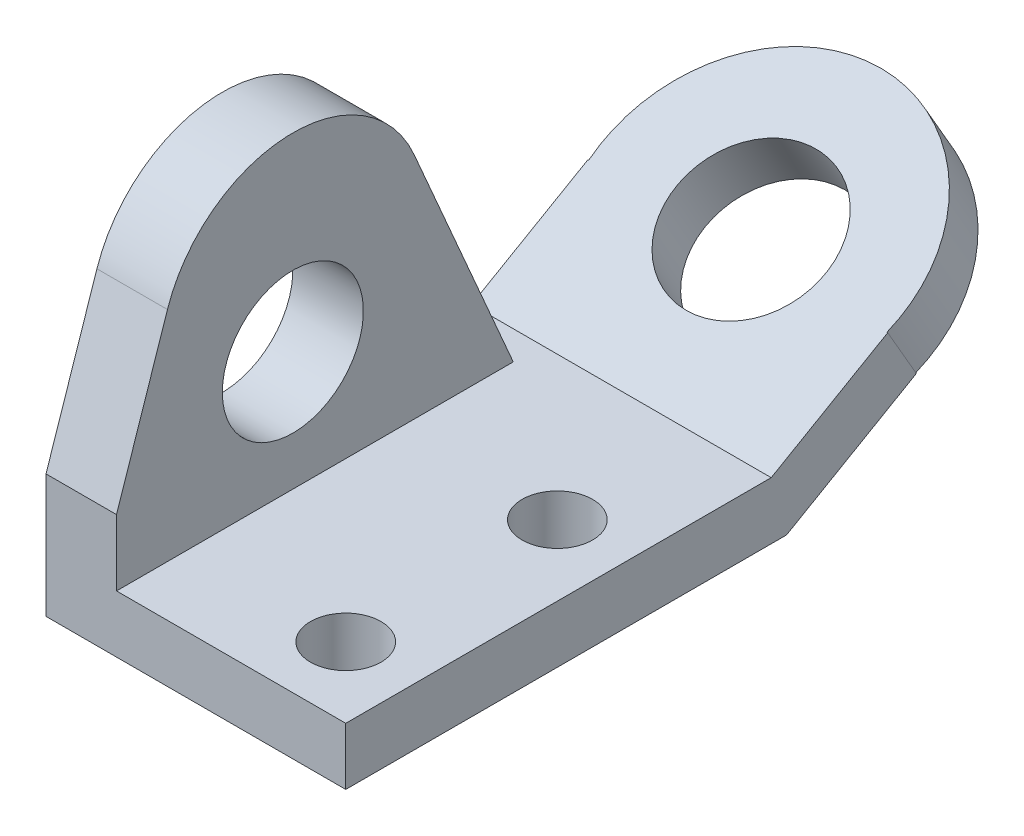
ISO-10303-21;
HEADER;
FILE_DESCRIPTION(('STEP AP214'),'2;1');
FILE_NAME('part.step','',(''),(''),'','','');
FILE_SCHEMA(('AUTOMOTIVE_DESIGN { 1 0 10303 214 1 1 1 1 }'));
ENDSEC;
DATA;
#1=APPLICATION_CONTEXT('core data for automotive mechanical design processes');
#2=APPLICATION_PROTOCOL_DEFINITION('international standard','automotive_design',2000,#1);
#3=PRODUCT_CONTEXT('',#1,'mechanical');
#4=PRODUCT('Part','Part','',(#3));
#5=PRODUCT_RELATED_PRODUCT_CATEGORY('part','',(#4));
#6=PRODUCT_DEFINITION_FORMATION('','',#4);
#7=PRODUCT_DEFINITION_CONTEXT('part definition',#1,'design');
#8=PRODUCT_DEFINITION('design','',#6,#7);
#9=PRODUCT_DEFINITION_SHAPE('','',#8);
#10=(LENGTH_UNIT() NAMED_UNIT(*) SI_UNIT(.MILLI.,.METRE.));
#11=(NAMED_UNIT(*) PLANE_ANGLE_UNIT() SI_UNIT($,.RADIAN.));
#12=(NAMED_UNIT(*) SI_UNIT($,.STERADIAN.) SOLID_ANGLE_UNIT());
#13=UNCERTAINTY_MEASURE_WITH_UNIT(LENGTH_MEASURE(1.E-05),#10,'distance_accuracy_value','');
#14=(GEOMETRIC_REPRESENTATION_CONTEXT(3) GLOBAL_UNCERTAINTY_ASSIGNED_CONTEXT((#13)) GLOBAL_UNIT_ASSIGNED_CONTEXT((#10,
#11,#12)) REPRESENTATION_CONTEXT('',''));
#15=CARTESIAN_POINT('',(0.,0.,0.));
#16=DIRECTION('',(0.,0.,1.));
#17=DIRECTION('',(1.,0.,0.));
#18=AXIS2_PLACEMENT_3D('',#15,#16,#17);
#19=CARTESIAN_POINT('',(-34.,0.,0.));
#20=DIRECTION('',(0.,1.,0.));
#21=DIRECTION('',(0.,0.,1.));
#22=AXIS2_PLACEMENT_3D('',#19,#20,#21);
#23=PLANE('',#22);
#24=DIRECTION('',(-1.,0.,0.));
#25=VECTOR('',#24,1.);
#26=CARTESIAN_POINT('',(-26.,0.,-25.));
#27=LINE('',#26,#25);
#28=CARTESIAN_POINT('',(-26.,0.,-25.));
#29=VERTEX_POINT('',#28);
#30=CARTESIAN_POINT('',(-34.,0.,-25.));
#31=VERTEX_POINT('',#30);
#32=EDGE_CURVE('E222',#29,#31,#27,.T.);
#33=ORIENTED_EDGE('',*,*,#32,.F.);
#34=DIRECTION('',(0.,0.,1.));
#35=VECTOR('',#34,1.);
#36=CARTESIAN_POINT('',(-26.,0.,-25.));
#37=LINE('',#36,#35);
#38=CARTESIAN_POINT('',(-26.,0.,20.));
#39=VERTEX_POINT('',#38);
#40=EDGE_CURVE('E199',#29,#39,#37,.T.);
#41=ORIENTED_EDGE('',*,*,#40,.T.);
#42=DIRECTION('',(1.,0.,0.));
#43=VECTOR('',#42,1.);
#44=CARTESIAN_POINT('',(-34.,0.,20.));
#45=LINE('',#44,#43);
#46=CARTESIAN_POINT('',(0.,0.,20.));
#47=VERTEX_POINT('',#46);
#48=EDGE_CURVE('E158',#39,#47,#45,.T.);
#49=ORIENTED_EDGE('',*,*,#48,.T.);
#50=DIRECTION('',(0.,0.,1.));
#51=VECTOR('',#50,1.);
#52=CARTESIAN_POINT('',(0.,0.,0.));
#53=LINE('',#52,#51);
#54=CARTESIAN_POINT('',(0.,0.,-28.2583302491977));
#55=VERTEX_POINT('',#54);
#56=EDGE_CURVE('E146',#55,#47,#53,.T.);
#57=ORIENTED_EDGE('',*,*,#56,.F.);
#58=DIRECTION('',(1.,0.,0.));
#59=VECTOR('',#58,1.);
#60=CARTESIAN_POINT('',(-34.,0.,-28.2583302491977));
#61=LINE('',#60,#59);
#62=CARTESIAN_POINT('',(-34.,0.,-28.2583302491977));
#63=VERTEX_POINT('',#62);
#64=EDGE_CURVE('E47',#63,#55,#61,.T.);
#65=ORIENTED_EDGE('',*,*,#64,.F.);
#66=DIRECTION('',(0.,0.,1.));
#67=VECTOR('',#66,1.);
#68=CARTESIAN_POINT('',(-34.,0.,20.));
#69=LINE('',#68,#67);
#70=EDGE_CURVE('E148',#63,#31,#69,.T.);
#71=ORIENTED_EDGE('',*,*,#70,.T.);
#72=EDGE_LOOP('',(#33,#41,#49,#57,#65,#71));
#73=FACE_BOUND('',#72,.T.);
#74=CARTESIAN_POINT('',(-8.,0.,12.));
#75=DIRECTION('',(0.,1.,0.));
#76=DIRECTION('',(0.,0.,1.));
#77=AXIS2_PLACEMENT_3D('',#74,#75,#76);
#78=CIRCLE('',#77,4.);
#79=CARTESIAN_POINT('',(-8.,0.,16.));
#80=VERTEX_POINT('',#79);
#81=EDGE_CURVE('E174',#80,#80,#78,.T.);
#82=ORIENTED_EDGE('',*,*,#81,.F.);
#83=EDGE_LOOP('',(#82));
#84=FACE_BOUND('',#83,.T.);
#85=CARTESIAN_POINT('',(-8.,0.,-12.));
#86=DIRECTION('',(0.,1.,0.));
#87=DIRECTION('',(0.,0.,1.));
#88=AXIS2_PLACEMENT_3D('',#85,#86,#87);
#89=CIRCLE('',#88,4.);
#90=CARTESIAN_POINT('',(-8.,0.,-8.));
#91=VERTEX_POINT('',#90);
#92=EDGE_CURVE('E225',#91,#91,#89,.T.);
#93=ORIENTED_EDGE('',*,*,#92,.F.);
#94=EDGE_LOOP('',(#93));
#95=FACE_BOUND('',#94,.T.);
#96=ADVANCED_FACE('F39',(#73,#84,#95),#23,.T.);
#97=CARTESIAN_POINT('',(-34.,0.,-28.2583302491977));
#98=DIRECTION('',(0.,0.866025403784438,0.500000000000002));
#99=DIRECTION('',(0.,-0.500000000000002,0.866025403784438));
#100=AXIS2_PLACEMENT_3D('',#97,#98,#99);
#101=PLANE('',#100);
#102=CARTESIAN_POINT('',(-17.,8.50000000000004,-42.9807621135332));
#103=DIRECTION('',(0.,0.866025403784438,0.500000000000002));
#104=DIRECTION('',(0.,-0.500000000000002,0.866025403784438));
#105=AXIS2_PLACEMENT_3D('',#102,#103,#104);
#106=CIRCLE('',#105,8.5);
#107=CARTESIAN_POINT('',(-17.,4.25000000000003,-35.6195461813655));
#108=VERTEX_POINT('',#107);
#109=EDGE_CURVE('E257',#108,#108,#106,.T.);
#110=ORIENTED_EDGE('',*,*,#109,.F.);
#111=EDGE_LOOP('',(#110));
#112=FACE_BOUND('',#111,.T.);
#113=ORIENTED_EDGE('',*,*,#64,.T.);
#114=DIRECTION('',(0.,-0.500000000000002,0.866025403784438));
#115=VECTOR('',#114,1.);
#116=CARTESIAN_POINT('',(0.,0.,-28.2583302491977));
#117=LINE('',#116,#115);
#118=CARTESIAN_POINT('',(0.,7.62916512459887,-41.4724318643354));
#119=VERTEX_POINT('',#118);
#120=EDGE_CURVE('E137',#119,#55,#117,.T.);
#121=ORIENTED_EDGE('',*,*,#120,.F.);
#122=DIRECTION('',(1.,0.,0.));
#123=VECTOR('',#122,1.);
#124=CARTESIAN_POINT('',(-34.001,7.62916512459887,-41.4724318643354));
#125=LINE('',#124,#123);
#126=CARTESIAN_POINT('',(-0.0894533950217824,7.62916512459887,-41.4724318643354));
#127=VERTEX_POINT('',#126);
#128=EDGE_CURVE('E122',#127,#119,#125,.T.);
#129=ORIENTED_EDGE('',*,*,#128,.F.);
#130=CARTESIAN_POINT('',(-17.,8.50000000000004,-42.9807621135332));
#131=DIRECTION('',(0.,0.866025403784438,0.500000000000002));
#132=DIRECTION('',(0.,-0.500000000000002,0.866025403784438));
#133=AXIS2_PLACEMENT_3D('',#130,#131,#132);
#134=CIRCLE('',#133,17.);
#135=CARTESIAN_POINT('',(-33.9105466049782,7.62916512459887,-41.4724318643354));
#136=VERTEX_POINT('',#135);
#137=EDGE_CURVE('E254',#127,#136,#134,.T.);
#138=ORIENTED_EDGE('',*,*,#137,.T.);
#139=CARTESIAN_POINT('',(-34.,7.62916512459887,-41.4724318643354));
#140=VERTEX_POINT('',#139);
#141=EDGE_CURVE('E131',#140,#136,#125,.T.);
#142=ORIENTED_EDGE('',*,*,#141,.F.);
#143=DIRECTION('',(0.,-0.500000000000002,0.866025403784438));
#144=VECTOR('',#143,1.);
#145=CARTESIAN_POINT('',(-34.,0.,-28.2583302491977));
#146=LINE('',#145,#144);
#147=EDGE_CURVE('E159',#140,#63,#146,.T.);
#148=ORIENTED_EDGE('',*,*,#147,.T.);
#149=EDGE_LOOP('',(#113,#121,#129,#138,#142,#148));
#150=FACE_BOUND('',#149,.T.);
#151=ADVANCED_FACE('F144',(#112,#150),#101,.T.);
#152=CARTESIAN_POINT('',(-34.,10.5,-59.4448637286709));
#153=DIRECTION('',(0.,-0.866025403784438,-0.500000000000001));
#154=DIRECTION('',(0.,0.500000000000001,-0.866025403784438));
#155=AXIS2_PLACEMENT_3D('',#152,#153,#154);
#156=PLANE('',#155);
#157=CARTESIAN_POINT('',(-17.,2.8708348754012,-46.2307621135332));
#158=DIRECTION('',(0.,-0.866025403784438,-0.500000000000001));
#159=DIRECTION('',(0.,0.500000000000001,-0.866025403784438));
#160=AXIS2_PLACEMENT_3D('',#157,#158,#159);
#161=CIRCLE('',#160,8.5);
#162=CARTESIAN_POINT('',(-17.,7.12083487540121,-53.5919780457009));
#163=VERTEX_POINT('',#162);
#164=EDGE_CURVE('E260',#163,#163,#161,.F.);
#165=ORIENTED_EDGE('',*,*,#164,.T.);
#166=EDGE_LOOP('',(#165));
#167=FACE_BOUND('',#166,.T.);
#168=DIRECTION('',(1.,0.,0.));
#169=VECTOR('',#168,1.);
#170=CARTESIAN_POINT('',(-34.001,2.00000000000003,-44.7224318643354));
#171=LINE('',#170,#169);
#172=CARTESIAN_POINT('',(-34.,2.00000000000003,-44.7224318643354));
#173=VERTEX_POINT('',#172);
#174=CARTESIAN_POINT('',(-33.9105466049782,2.00000000000003,-44.7224318643354));
#175=VERTEX_POINT('',#174);
#176=EDGE_CURVE('E188',#173,#175,#171,.T.);
#177=ORIENTED_EDGE('',*,*,#176,.T.);
#178=CARTESIAN_POINT('',(-17.,2.87083487540119,-46.2307621135332));
#179=DIRECTION('',(0.,0.866025403784438,0.500000000000002));
#180=DIRECTION('',(0.,-0.500000000000002,0.866025403784438));
#181=AXIS2_PLACEMENT_3D('',#178,#179,#180);
#182=CIRCLE('',#181,17.);
#183=CARTESIAN_POINT('',(-0.0894533950217824,2.00000000000003,-44.7224318643354));
#184=VERTEX_POINT('',#183);
#185=EDGE_CURVE('E187',#184,#175,#182,.T.);
#186=ORIENTED_EDGE('',*,*,#185,.F.);
#187=CARTESIAN_POINT('',(0.,2.00000000000003,-44.7224318643354));
#188=VERTEX_POINT('',#187);
#189=EDGE_CURVE('E54',#184,#188,#171,.T.);
#190=ORIENTED_EDGE('',*,*,#189,.T.);
#191=DIRECTION('',(0.,0.500000000000001,-0.866025403784438));
#192=VECTOR('',#191,1.);
#193=CARTESIAN_POINT('',(0.,10.5,-59.4448637286709));
#194=LINE('',#193,#192);
#195=CARTESIAN_POINT('',(0.,-6.49999999999999,-30.));
#196=VERTEX_POINT('',#195);
#197=EDGE_CURVE('E141',#196,#188,#194,.T.);
#198=ORIENTED_EDGE('',*,*,#197,.F.);
#199=DIRECTION('',(1.,0.,0.));
#200=VECTOR('',#199,1.);
#201=CARTESIAN_POINT('',(-34.,-6.49999999999999,-30.));
#202=LINE('',#201,#200);
#203=CARTESIAN_POINT('',(-34.,-6.49999999999999,-30.));
#204=VERTEX_POINT('',#203);
#205=EDGE_CURVE('E155',#204,#196,#202,.T.);
#206=ORIENTED_EDGE('',*,*,#205,.F.);
#207=DIRECTION('',(0.,0.500000000000001,-0.866025403784438));
#208=VECTOR('',#207,1.);
#209=CARTESIAN_POINT('',(-34.,10.5,-59.4448637286709));
#210=LINE('',#209,#208);
#211=EDGE_CURVE('E162',#204,#173,#210,.T.);
#212=ORIENTED_EDGE('',*,*,#211,.T.);
#213=EDGE_LOOP('',(#177,#186,#190,#198,#206,#212));
#214=FACE_BOUND('',#213,.T.);
#215=ADVANCED_FACE('F184',(#167,#214),#156,.T.);
#216=CARTESIAN_POINT('',(-34.,-6.49999999999999,-30.));
#217=DIRECTION('',(0.,-1.,0.));
#218=DIRECTION('',(0.,0.,-1.));
#219=AXIS2_PLACEMENT_3D('',#216,#217,#218);
#220=PLANE('',#219);
#221=CARTESIAN_POINT('',(-8.,-6.5,12.));
#222=DIRECTION('',(0.,-1.,0.));
#223=DIRECTION('',(0.,0.,-1.));
#224=AXIS2_PLACEMENT_3D('',#221,#222,#223);
#225=CIRCLE('',#224,4.);
#226=CARTESIAN_POINT('',(-8.,-6.5,16.));
#227=VERTEX_POINT('',#226);
#228=EDGE_CURVE('E234',#227,#227,#225,.F.);
#229=ORIENTED_EDGE('',*,*,#228,.T.);
#230=EDGE_LOOP('',(#229));
#231=FACE_BOUND('',#230,.T.);
#232=CARTESIAN_POINT('',(-8.,-6.5,-12.));
#233=DIRECTION('',(0.,-1.,0.));
#234=DIRECTION('',(0.,0.,-1.));
#235=AXIS2_PLACEMENT_3D('',#232,#233,#234);
#236=CIRCLE('',#235,4.);
#237=CARTESIAN_POINT('',(-8.,-6.5,-8.));
#238=VERTEX_POINT('',#237);
#239=EDGE_CURVE('E237',#238,#238,#236,.F.);
#240=ORIENTED_EDGE('',*,*,#239,.T.);
#241=EDGE_LOOP('',(#240));
#242=FACE_BOUND('',#241,.T.);
#243=DIRECTION('',(0.,0.,-1.));
#244=VECTOR('',#243,1.);
#245=CARTESIAN_POINT('',(0.,-6.49999999999999,-30.));
#246=LINE('',#245,#244);
#247=CARTESIAN_POINT('',(0.,-6.5,20.));
#248=VERTEX_POINT('',#247);
#249=EDGE_CURVE('E150',#248,#196,#246,.T.);
#250=ORIENTED_EDGE('',*,*,#249,.F.);
#251=DIRECTION('',(1.,0.,0.));
#252=VECTOR('',#251,1.);
#253=CARTESIAN_POINT('',(-34.,-6.5,20.));
#254=LINE('',#253,#252);
#255=CARTESIAN_POINT('',(-34.,-6.5,20.));
#256=VERTEX_POINT('',#255);
#257=EDGE_CURVE('E157',#256,#248,#254,.T.);
#258=ORIENTED_EDGE('',*,*,#257,.F.);
#259=DIRECTION('',(0.,0.,-1.));
#260=VECTOR('',#259,1.);
#261=CARTESIAN_POINT('',(-34.,-6.49999999999999,-30.));
#262=LINE('',#261,#260);
#263=EDGE_CURVE('E168',#256,#204,#262,.T.);
#264=ORIENTED_EDGE('',*,*,#263,.T.);
#265=ORIENTED_EDGE('',*,*,#205,.T.);
#266=EDGE_LOOP('',(#250,#258,#264,#265));
#267=FACE_BOUND('',#266,.T.);
#268=ADVANCED_FACE('F178',(#231,#242,#267),#220,.T.);
#269=CARTESIAN_POINT('',(-34.,-6.5,20.));
#270=DIRECTION('',(0.,0.,1.));
#271=DIRECTION('',(1.,0.,0.));
#272=AXIS2_PLACEMENT_3D('',#269,#270,#271);
#273=PLANE('',#272);
#274=DIRECTION('',(0.,-1.,0.));
#275=VECTOR('',#274,1.);
#276=CARTESIAN_POINT('',(0.,-6.5,20.));
#277=LINE('',#276,#275);
#278=EDGE_CURVE('E172',#47,#248,#277,.T.);
#279=ORIENTED_EDGE('',*,*,#278,.F.);
#280=ORIENTED_EDGE('',*,*,#48,.F.);
#281=DIRECTION('',(0.,1.,0.));
#282=VECTOR('',#281,1.);
#283=CARTESIAN_POINT('',(-26.,0.,20.));
#284=LINE('',#283,#282);
#285=CARTESIAN_POINT('',(-26.,7.5,20.));
#286=VERTEX_POINT('',#285);
#287=EDGE_CURVE('E201',#39,#286,#284,.T.);
#288=ORIENTED_EDGE('',*,*,#287,.T.);
#289=DIRECTION('',(-1.,0.,0.));
#290=VECTOR('',#289,1.);
#291=CARTESIAN_POINT('',(-26.,7.5,20.));
#292=LINE('',#291,#290);
#293=CARTESIAN_POINT('',(-34.,7.5,20.));
#294=VERTEX_POINT('',#293);
#295=EDGE_CURVE('E214',#286,#294,#292,.T.);
#296=ORIENTED_EDGE('',*,*,#295,.T.);
#297=DIRECTION('',(0.,-1.,0.));
#298=VECTOR('',#297,1.);
#299=CARTESIAN_POINT('',(-34.,-6.5,20.));
#300=LINE('',#299,#298);
#301=EDGE_CURVE('E243',#294,#256,#300,.T.);
#302=ORIENTED_EDGE('',*,*,#301,.T.);
#303=ORIENTED_EDGE('',*,*,#257,.T.);
#304=EDGE_LOOP('',(#279,#280,#288,#296,#302,#303));
#305=FACE_BOUND('',#304,.T.);
#306=ADVANCED_FACE('F41',(#305),#273,.T.);
#307=CARTESIAN_POINT('',(-34.,0.,0.));
#308=DIRECTION('',(1.,0.,0.));
#309=DIRECTION('',(0.,0.,-1.));
#310=AXIS2_PLACEMENT_3D('',#307,#308,#309);
#311=PLANE('',#310);
#312=CARTESIAN_POINT('',(-34.,13.5,0.));
#313=DIRECTION('',(-1.,0.,0.));
#314=DIRECTION('',(0.,0.,1.));
#315=AXIS2_PLACEMENT_3D('',#312,#313,#314);
#316=CIRCLE('',#315,8.);
#317=CARTESIAN_POINT('',(-34.,13.5,8.));
#318=VERTEX_POINT('',#317);
#319=EDGE_CURVE('E190',#318,#318,#316,.T.);
#320=ORIENTED_EDGE('',*,*,#319,.F.);
#321=EDGE_LOOP('',(#320));
#322=FACE_BOUND('',#321,.T.);
#323=ORIENTED_EDGE('',*,*,#147,.F.);
#324=DIRECTION('',(0.,0.866025403784438,0.500000000000001));
#325=VECTOR('',#324,1.);
#326=CARTESIAN_POINT('',(-34.,2.00000000000003,-44.7224318643354));
#327=LINE('',#326,#325);
#328=EDGE_CURVE('E142',#173,#140,#327,.T.);
#329=ORIENTED_EDGE('',*,*,#328,.F.);
#330=ORIENTED_EDGE('',*,*,#211,.F.);
#331=ORIENTED_EDGE('',*,*,#263,.F.);
#332=ORIENTED_EDGE('',*,*,#301,.F.);
#333=DIRECTION('',(0.,0.948320780296658,-0.317313248474653));
#334=VECTOR('',#333,1.);
#335=CARTESIAN_POINT('',(-34.,7.5,20.));
#336=LINE('',#335,#334);
#337=CARTESIAN_POINT('',(-34.,24.7596987271198,14.2248117044499));
#338=VERTEX_POINT('',#337);
#339=EDGE_CURVE('E198',#294,#338,#336,.T.);
#340=ORIENTED_EDGE('',*,*,#339,.T.);
#341=CARTESIAN_POINT('',(-34.,20.,0.));
#342=DIRECTION('',(-1.,0.,0.));
#343=DIRECTION('',(0.,0.,1.));
#344=AXIS2_PLACEMENT_3D('',#341,#342,#343);
#345=CIRCLE('',#344,15.);
#346=CARTESIAN_POINT('',(-34.,25.9576602124861,-13.7661281699888));
#347=VERTEX_POINT('',#346);
#348=EDGE_CURVE('E217',#338,#347,#345,.T.);
#349=ORIENTED_EDGE('',*,*,#348,.T.);
#350=DIRECTION('',(0.,-0.917741877999256,-0.397177347499071));
#351=VECTOR('',#350,1.);
#352=CARTESIAN_POINT('',(-34.,0.,-25.));
#353=LINE('',#352,#351);
#354=EDGE_CURVE('E202',#347,#31,#353,.T.);
#355=ORIENTED_EDGE('',*,*,#354,.T.);
#356=ORIENTED_EDGE('',*,*,#70,.F.);
#357=EDGE_LOOP('',(#323,#329,#330,#331,#332,#340,#349,#355,#356));
#358=FACE_BOUND('',#357,.T.);
#359=ADVANCED_FACE('F248',(#322,#358),#311,.F.);
#360=CARTESIAN_POINT('',(0.,0.,0.));
#361=DIRECTION('',(1.,0.,0.));
#362=DIRECTION('',(0.,0.,-1.));
#363=AXIS2_PLACEMENT_3D('',#360,#361,#362);
#364=PLANE('',#363);
#365=DIRECTION('',(0.,-0.866025403784438,-0.500000000000001));
#366=VECTOR('',#365,1.);
#367=CARTESIAN_POINT('',(0.,2.00000000000003,-44.7224318643354));
#368=LINE('',#367,#366);
#369=EDGE_CURVE('E125',#119,#188,#368,.T.);
#370=ORIENTED_EDGE('',*,*,#369,.F.);
#371=ORIENTED_EDGE('',*,*,#120,.T.);
#372=ORIENTED_EDGE('',*,*,#56,.T.);
#373=ORIENTED_EDGE('',*,*,#278,.T.);
#374=ORIENTED_EDGE('',*,*,#249,.T.);
#375=ORIENTED_EDGE('',*,*,#197,.T.);
#376=EDGE_LOOP('',(#370,#371,#372,#373,#374,#375));
#377=FACE_BOUND('',#376,.T.);
#378=ADVANCED_FACE('F135',(#377),#364,.T.);
#379=CARTESIAN_POINT('',(-8.,-6.501,-12.));
#380=DIRECTION('',(0.,1.,0.));
#381=DIRECTION('',(0.,0.,1.));
#382=AXIS2_PLACEMENT_3D('',#379,#380,#381);
#383=CYLINDRICAL_SURFACE('',#382,4.);
#384=CARTESIAN_POINT('',(-8.,-6.5,-8.));
#385=CARTESIAN_POINT('',(-8.,-6.43229166666666,-8.));
#386=CARTESIAN_POINT('',(-8.,-6.36458333333333,-8.));
#387=CARTESIAN_POINT('',(-8.,-6.22916666666666,-8.));
#388=CARTESIAN_POINT('',(-8.,-6.16145833333333,-8.));
#389=CARTESIAN_POINT('',(-8.,-6.02604166666666,-8.));
#390=CARTESIAN_POINT('',(-8.,-5.95833333333333,-8.));
#391=CARTESIAN_POINT('',(-8.,-5.82291666666666,-8.));
#392=CARTESIAN_POINT('',(-8.,-5.75520833333333,-8.));
#393=CARTESIAN_POINT('',(-8.,-5.61979166666666,-8.));
#394=CARTESIAN_POINT('',(-8.,-5.55208333333333,-8.));
#395=CARTESIAN_POINT('',(-8.,-5.41666666666666,-8.));
#396=CARTESIAN_POINT('',(-8.,-5.34895833333333,-8.));
#397=CARTESIAN_POINT('',(-8.,-5.21354166666666,-8.));
#398=CARTESIAN_POINT('',(-8.,-5.14583333333333,-8.));
#399=CARTESIAN_POINT('',(-8.,-5.01041666666666,-8.));
#400=CARTESIAN_POINT('',(-8.,-4.94270833333333,-8.));
#401=CARTESIAN_POINT('',(-8.,-4.80729166666666,-8.));
#402=CARTESIAN_POINT('',(-8.,-4.73958333333333,-8.));
#403=CARTESIAN_POINT('',(-8.,-4.60416666666667,-8.));
#404=CARTESIAN_POINT('',(-8.,-4.53645833333333,-8.));
#405=CARTESIAN_POINT('',(-8.,-4.40104166666667,-8.));
#406=CARTESIAN_POINT('',(-8.,-4.33333333333333,-8.));
#407=CARTESIAN_POINT('',(-8.,-4.19791666666667,-8.));
#408=CARTESIAN_POINT('',(-8.,-4.13020833333333,-8.));
#409=CARTESIAN_POINT('',(-8.,-3.99479166666667,-8.));
#410=CARTESIAN_POINT('',(-8.,-3.92708333333333,-8.));
#411=CARTESIAN_POINT('',(-8.,-3.79166666666667,-8.));
#412=CARTESIAN_POINT('',(-8.,-3.72395833333333,-8.));
#413=CARTESIAN_POINT('',(-8.,-3.58854166666667,-8.));
#414=CARTESIAN_POINT('',(-8.,-3.52083333333333,-8.));
#415=CARTESIAN_POINT('',(-8.,-3.38541666666667,-8.));
#416=CARTESIAN_POINT('',(-8.,-3.31770833333333,-8.));
#417=CARTESIAN_POINT('',(-8.,-3.18229166666667,-8.));
#418=CARTESIAN_POINT('',(-8.,-3.11458333333333,-8.));
#419=CARTESIAN_POINT('',(-8.,-2.97916666666667,-8.));
#420=CARTESIAN_POINT('',(-8.,-2.91145833333333,-8.));
#421=CARTESIAN_POINT('',(-8.,-2.77604166666667,-8.));
#422=CARTESIAN_POINT('',(-8.,-2.70833333333333,-8.));
#423=CARTESIAN_POINT('',(-8.,-2.57291666666667,-8.));
#424=CARTESIAN_POINT('',(-8.,-2.50520833333333,-8.));
#425=CARTESIAN_POINT('',(-8.,-2.36979166666667,-8.));
#426=CARTESIAN_POINT('',(-8.,-2.30208333333333,-8.));
#427=CARTESIAN_POINT('',(-8.,-2.16666666666667,-8.));
#428=CARTESIAN_POINT('',(-8.,-2.09895833333333,-8.));
#429=CARTESIAN_POINT('',(-8.,-1.96354166666667,-8.));
#430=CARTESIAN_POINT('',(-8.,-1.89583333333333,-8.));
#431=CARTESIAN_POINT('',(-8.,-1.76041666666667,-8.));
#432=CARTESIAN_POINT('',(-8.,-1.69270833333333,-8.));
#433=CARTESIAN_POINT('',(-8.,-1.55729166666667,-8.));
#434=CARTESIAN_POINT('',(-8.,-1.48958333333333,-8.));
#435=CARTESIAN_POINT('',(-8.,-1.35416666666667,-8.));
#436=CARTESIAN_POINT('',(-8.,-1.28645833333333,-8.));
#437=CARTESIAN_POINT('',(-8.,-1.15104166666667,-8.));
#438=CARTESIAN_POINT('',(-8.,-1.08333333333333,-8.));
#439=CARTESIAN_POINT('',(-8.,-0.947916666666667,-8.));
#440=CARTESIAN_POINT('',(-8.,-0.880208333333334,-8.));
#441=CARTESIAN_POINT('',(-8.,-0.744791666666667,-8.));
#442=CARTESIAN_POINT('',(-8.,-0.677083333333334,-8.));
#443=CARTESIAN_POINT('',(-8.,-0.541666666666667,-8.));
#444=CARTESIAN_POINT('',(-8.,-0.473958333333334,-8.));
#445=CARTESIAN_POINT('',(-8.,-0.338541666666667,-8.));
#446=CARTESIAN_POINT('',(-8.,-0.270833333333334,-8.));
#447=CARTESIAN_POINT('',(-8.,-0.135416666666668,-8.));
#448=CARTESIAN_POINT('',(-8.,-0.0677083333333343,-8.));
#449=CARTESIAN_POINT('',(-8.,0.,-8.));
#450=B_SPLINE_CURVE_WITH_KNOTS('',3,(#384,#385,#386,#387,#388,#389,#390,#391,#392,#393,#394,
#395,#396,#397,#398,#399,#400,#401,#402,#403,#404,#405,#406,#407,#408,#409,#410,#411,#412,#413,
#414,#415,#416,#417,#418,#419,#420,#421,#422,#423,#424,#425,#426,#427,#428,#429,#430,#431,#432,
#433,#434,#435,#436,#437,#438,#439,#440,#441,#442,#443,#444,#445,#446,#447,#448,#449),
.UNSPECIFIED.,.F.,.F.,(4,2,2,2,2,2,2,2,2,2,2,2,2,2,2,2,2,2,2,2,2,2,2,2,2,2,2,2,2,2,2,2,4),(0.,
0.203124999999999,0.40625,0.609374999999999,0.812499999999999,1.015625,1.21875,1.421875,1.625,
1.828125,2.03125,2.234375,2.4375,2.640625,2.84375,3.046875,3.25,3.453125,3.65625,3.859375,
4.0625,4.265625,4.46875,4.671875,4.875,5.078125,5.28125,5.484375,5.6875,5.890625,6.09375,
6.296875,6.5),.UNSPECIFIED.);
#451=EDGE_CURVE('BSEAM287',#238,#91,#450,.T.);
#452=ORIENTED_EDGE('',*,*,#239,.F.);
#453=ORIENTED_EDGE('',*,*,#92,.T.);
#454=ORIENTED_EDGE('',*,*,#451,.T.);
#455=ORIENTED_EDGE('',*,*,#451,.F.);
#456=EDGE_LOOP('',(#452,#454,#453,#455));
#457=FACE_BOUND('',#456,.T.);
#458=ADVANCED_FACE('F287',(#457),#383,.F.);
#459=CARTESIAN_POINT('',(-8.,-6.501,12.));
#460=DIRECTION('',(0.,1.,0.));
#461=DIRECTION('',(0.,0.,1.));
#462=AXIS2_PLACEMENT_3D('',#459,#460,#461);
#463=CYLINDRICAL_SURFACE('',#462,4.);
#464=CARTESIAN_POINT('',(-8.,-6.5,16.));
#465=CARTESIAN_POINT('',(-8.,-6.43229166666667,16.));
#466=CARTESIAN_POINT('',(-8.,-6.36458333333333,16.));
#467=CARTESIAN_POINT('',(-8.,-6.22916666666667,16.));
#468=CARTESIAN_POINT('',(-8.,-6.16145833333333,16.));
#469=CARTESIAN_POINT('',(-8.,-6.02604166666667,16.));
#470=CARTESIAN_POINT('',(-8.,-5.95833333333333,16.));
#471=CARTESIAN_POINT('',(-8.,-5.82291666666667,16.));
#472=CARTESIAN_POINT('',(-8.,-5.75520833333333,16.));
#473=CARTESIAN_POINT('',(-8.,-5.61979166666667,16.));
#474=CARTESIAN_POINT('',(-8.,-5.55208333333333,16.));
#475=CARTESIAN_POINT('',(-8.,-5.41666666666667,16.));
#476=CARTESIAN_POINT('',(-8.,-5.34895833333333,16.));
#477=CARTESIAN_POINT('',(-8.,-5.21354166666667,16.));
#478=CARTESIAN_POINT('',(-8.,-5.14583333333333,16.));
#479=CARTESIAN_POINT('',(-8.,-5.01041666666667,16.));
#480=CARTESIAN_POINT('',(-8.,-4.94270833333333,16.));
#481=CARTESIAN_POINT('',(-8.,-4.80729166666667,16.));
#482=CARTESIAN_POINT('',(-8.,-4.73958333333333,16.));
#483=CARTESIAN_POINT('',(-8.,-4.60416666666667,16.));
#484=CARTESIAN_POINT('',(-8.,-4.53645833333333,16.));
#485=CARTESIAN_POINT('',(-8.,-4.40104166666667,16.));
#486=CARTESIAN_POINT('',(-8.,-4.33333333333333,16.));
#487=CARTESIAN_POINT('',(-8.,-4.19791666666667,16.));
#488=CARTESIAN_POINT('',(-8.,-4.13020833333333,16.));
#489=CARTESIAN_POINT('',(-8.,-3.99479166666667,16.));
#490=CARTESIAN_POINT('',(-8.,-3.92708333333333,16.));
#491=CARTESIAN_POINT('',(-8.,-3.79166666666667,16.));
#492=CARTESIAN_POINT('',(-8.,-3.72395833333333,16.));
#493=CARTESIAN_POINT('',(-8.,-3.58854166666667,16.));
#494=CARTESIAN_POINT('',(-8.,-3.52083333333333,16.));
#495=CARTESIAN_POINT('',(-8.,-3.38541666666667,16.));
#496=CARTESIAN_POINT('',(-8.,-3.31770833333333,16.));
#497=CARTESIAN_POINT('',(-8.,-3.18229166666667,16.));
#498=CARTESIAN_POINT('',(-8.,-3.11458333333333,16.));
#499=CARTESIAN_POINT('',(-8.,-2.97916666666667,16.));
#500=CARTESIAN_POINT('',(-8.,-2.91145833333333,16.));
#501=CARTESIAN_POINT('',(-8.,-2.77604166666667,16.));
#502=CARTESIAN_POINT('',(-8.,-2.70833333333333,16.));
#503=CARTESIAN_POINT('',(-8.,-2.57291666666667,16.));
#504=CARTESIAN_POINT('',(-8.,-2.50520833333333,16.));
#505=CARTESIAN_POINT('',(-8.,-2.36979166666667,16.));
#506=CARTESIAN_POINT('',(-8.,-2.30208333333333,16.));
#507=CARTESIAN_POINT('',(-8.,-2.16666666666667,16.));
#508=CARTESIAN_POINT('',(-8.,-2.09895833333333,16.));
#509=CARTESIAN_POINT('',(-8.,-1.96354166666667,16.));
#510=CARTESIAN_POINT('',(-8.,-1.89583333333333,16.));
#511=CARTESIAN_POINT('',(-8.,-1.76041666666667,16.));
#512=CARTESIAN_POINT('',(-8.,-1.69270833333333,16.));
#513=CARTESIAN_POINT('',(-8.,-1.55729166666667,16.));
#514=CARTESIAN_POINT('',(-8.,-1.48958333333333,16.));
#515=CARTESIAN_POINT('',(-8.,-1.35416666666667,16.));
#516=CARTESIAN_POINT('',(-8.,-1.28645833333333,16.));
#517=CARTESIAN_POINT('',(-8.,-1.15104166666667,16.));
#518=CARTESIAN_POINT('',(-8.,-1.08333333333333,16.));
#519=CARTESIAN_POINT('',(-8.,-0.947916666666668,16.));
#520=CARTESIAN_POINT('',(-8.,-0.880208333333335,16.));
#521=CARTESIAN_POINT('',(-8.,-0.744791666666668,16.));
#522=CARTESIAN_POINT('',(-8.,-0.677083333333335,16.));
#523=CARTESIAN_POINT('',(-8.,-0.541666666666668,16.));
#524=CARTESIAN_POINT('',(-8.,-0.473958333333335,16.));
#525=CARTESIAN_POINT('',(-8.,-0.338541666666668,16.));
#526=CARTESIAN_POINT('',(-8.,-0.270833333333334,16.));
#527=CARTESIAN_POINT('',(-8.,-0.135416666666668,16.));
#528=CARTESIAN_POINT('',(-8.,-0.0677083333333342,16.));
#529=CARTESIAN_POINT('',(-8.,0.,16.));
#530=B_SPLINE_CURVE_WITH_KNOTS('',3,(#464,#465,#466,#467,#468,#469,#470,#471,#472,#473,#474,
#475,#476,#477,#478,#479,#480,#481,#482,#483,#484,#485,#486,#487,#488,#489,#490,#491,#492,#493,
#494,#495,#496,#497,#498,#499,#500,#501,#502,#503,#504,#505,#506,#507,#508,#509,#510,#511,#512,
#513,#514,#515,#516,#517,#518,#519,#520,#521,#522,#523,#524,#525,#526,#527,#528,#529),
.UNSPECIFIED.,.F.,.F.,(4,2,2,2,2,2,2,2,2,2,2,2,2,2,2,2,2,2,2,2,2,2,2,2,2,2,2,2,2,2,2,2,4),(0.,
0.203125,0.40625,0.609375000000001,0.8125,1.015625,1.21875,1.421875,1.625,1.828125,2.03125,
2.234375,2.4375,2.640625,2.84375,3.046875,3.25,3.453125,3.65625,3.859375,4.0625,4.265625,
4.46875,4.671875,4.875,5.078125,5.28125,5.484375,5.6875,5.890625,6.09375,6.296875,6.5),.UNSPECIFIED.);
#531=EDGE_CURVE('BSEAM280',#227,#80,#530,.T.);
#532=ORIENTED_EDGE('',*,*,#228,.F.);
#533=ORIENTED_EDGE('',*,*,#81,.T.);
#534=ORIENTED_EDGE('',*,*,#531,.T.);
#535=ORIENTED_EDGE('',*,*,#531,.F.);
#536=EDGE_LOOP('',(#532,#534,#533,#535));
#537=FACE_BOUND('',#536,.T.);
#538=ADVANCED_FACE('F280',(#537),#463,.F.);
#539=CARTESIAN_POINT('',(-26.,0.,-25.));
#540=DIRECTION('',(0.,0.397177347499071,-0.917741877999256));
#541=DIRECTION('',(0.,0.917741877999257,0.397177347499071));
#542=AXIS2_PLACEMENT_3D('',#539,#540,#541);
#543=PLANE('',#542);
#544=ORIENTED_EDGE('',*,*,#354,.F.);
#545=DIRECTION('',(-1.,0.,0.));
#546=VECTOR('',#545,1.);
#547=CARTESIAN_POINT('',(-26.,25.9576602124861,-13.7661281699888));
#548=LINE('',#547,#546);
#549=CARTESIAN_POINT('',(-26.,25.9576602124861,-13.7661281699888));
#550=VERTEX_POINT('',#549);
#551=EDGE_CURVE('E226',#550,#347,#548,.T.);
#552=ORIENTED_EDGE('',*,*,#551,.F.);
#553=DIRECTION('',(0.,-0.917741877999256,-0.397177347499071));
#554=VECTOR('',#553,1.);
#555=CARTESIAN_POINT('',(-26.,0.,-25.));
#556=LINE('',#555,#554);
#557=EDGE_CURVE('E211',#550,#29,#556,.T.);
#558=ORIENTED_EDGE('',*,*,#557,.T.);
#559=ORIENTED_EDGE('',*,*,#32,.T.);
#560=EDGE_LOOP('',(#544,#552,#558,#559));
#561=FACE_BOUND('',#560,.T.);
#562=ADVANCED_FACE('F278',(#561),#543,.T.);
#563=CARTESIAN_POINT('',(-26.,20.,0.));
#564=DIRECTION('',(-1.,0.,0.));
#565=DIRECTION('',(0.,0.,1.));
#566=AXIS2_PLACEMENT_3D('',#563,#564,#565);
#567=CYLINDRICAL_SURFACE('',#566,15.);
#568=ORIENTED_EDGE('',*,*,#348,.F.);
#569=DIRECTION('',(-1.,0.,0.));
#570=VECTOR('',#569,1.);
#571=CARTESIAN_POINT('',(-26.,24.7596987271198,14.2248117044499));
#572=LINE('',#571,#570);
#573=CARTESIAN_POINT('',(-26.,24.7596987271198,14.2248117044499));
#574=VERTEX_POINT('',#573);
#575=EDGE_CURVE('E228',#574,#338,#572,.T.);
#576=ORIENTED_EDGE('',*,*,#575,.F.);
#577=CARTESIAN_POINT('',(-26.,20.,0.));
#578=DIRECTION('',(-1.,0.,0.));
#579=DIRECTION('',(0.,0.,1.));
#580=AXIS2_PLACEMENT_3D('',#577,#578,#579);
#581=CIRCLE('',#580,15.);
#582=EDGE_CURVE('E208',#574,#550,#581,.T.);
#583=ORIENTED_EDGE('',*,*,#582,.T.);
#584=ORIENTED_EDGE('',*,*,#551,.T.);
#585=EDGE_LOOP('',(#568,#576,#583,#584));
#586=FACE_BOUND('',#585,.T.);
#587=ADVANCED_FACE('F276',(#586),#567,.T.);
#588=CARTESIAN_POINT('',(-26.,7.5,20.));
#589=DIRECTION('',(0.,0.317313248474653,0.948320780296658));
#590=DIRECTION('',(0.,-0.948320780296658,0.317313248474653));
#591=AXIS2_PLACEMENT_3D('',#588,#589,#590);
#592=PLANE('',#591);
#593=ORIENTED_EDGE('',*,*,#339,.F.);
#594=ORIENTED_EDGE('',*,*,#295,.F.);
#595=DIRECTION('',(0.,0.948320780296658,-0.317313248474653));
#596=VECTOR('',#595,1.);
#597=CARTESIAN_POINT('',(-26.,7.5,20.));
#598=LINE('',#597,#596);
#599=EDGE_CURVE('E205',#286,#574,#598,.T.);
#600=ORIENTED_EDGE('',*,*,#599,.T.);
#601=ORIENTED_EDGE('',*,*,#575,.T.);
#602=EDGE_LOOP('',(#593,#594,#600,#601));
#603=FACE_BOUND('',#602,.T.);
#604=ADVANCED_FACE('F273',(#603),#592,.T.);
#605=CARTESIAN_POINT('',(-26.,20.,0.));
#606=DIRECTION('',(-1.,0.,0.));
#607=DIRECTION('',(0.,0.,1.));
#608=AXIS2_PLACEMENT_3D('',#605,#606,#607);
#609=PLANE('',#608);
#610=CARTESIAN_POINT('',(-26.,13.5,0.));
#611=DIRECTION('',(-1.,0.,0.));
#612=DIRECTION('',(0.,0.,1.));
#613=AXIS2_PLACEMENT_3D('',#610,#611,#612);
#614=CIRCLE('',#613,8.);
#615=CARTESIAN_POINT('',(-26.,13.5,8.));
#616=VERTEX_POINT('',#615);
#617=EDGE_CURVE('E195',#616,#616,#614,.F.);
#618=ORIENTED_EDGE('',*,*,#617,.F.);
#619=EDGE_LOOP('',(#618));
#620=FACE_BOUND('',#619,.T.);
#621=ORIENTED_EDGE('',*,*,#40,.F.);
#622=ORIENTED_EDGE('',*,*,#557,.F.);
#623=ORIENTED_EDGE('',*,*,#582,.F.);
#624=ORIENTED_EDGE('',*,*,#599,.F.);
#625=ORIENTED_EDGE('',*,*,#287,.F.);
#626=EDGE_LOOP('',(#621,#622,#623,#624,#625));
#627=FACE_BOUND('',#626,.T.);
#628=ADVANCED_FACE('F269',(#620,#627),#609,.F.);
#629=CARTESIAN_POINT('',(0.001000000000001,13.5,0.));
#630=DIRECTION('',(-1.,0.,0.));
#631=DIRECTION('',(0.,0.,1.));
#632=AXIS2_PLACEMENT_3D('',#629,#630,#631);
#633=CYLINDRICAL_SURFACE('',#632,8.);
#634=ORIENTED_EDGE('',*,*,#319,.T.);
#635=EDGE_LOOP('',(#634));
#636=FACE_BOUND('',#635,.T.);
#637=ORIENTED_EDGE('',*,*,#617,.T.);
#638=EDGE_LOOP('',(#637));
#639=FACE_BOUND('',#638,.T.);
#640=ADVANCED_FACE('F327',(#636,#639),#633,.F.);
#641=CARTESIAN_POINT('',(-34.001,2.00000000000003,-44.7224318643354));
#642=DIRECTION('',(0.,-0.500000000000001,0.866025403784438));
#643=DIRECTION('',(0.,-0.866025403784438,-0.500000000000001));
#644=AXIS2_PLACEMENT_3D('',#641,#642,#643);
#645=PLANE('',#644);
#646=ORIENTED_EDGE('',*,*,#189,.F.);
#647=DIRECTION('',(0.,0.866025403784438,0.500000000000002));
#648=VECTOR('',#647,1.);
#649=CARTESIAN_POINT('',(-0.0894533950217824,2.00000000000002,-44.7224318643354));
#650=LINE('',#649,#648);
#651=EDGE_CURVE('E58',#184,#127,#650,.T.);
#652=ORIENTED_EDGE('',*,*,#651,.T.);
#653=ORIENTED_EDGE('',*,*,#128,.T.);
#654=ORIENTED_EDGE('',*,*,#369,.T.);
#655=EDGE_LOOP('',(#646,#652,#653,#654));
#656=FACE_BOUND('',#655,.T.);
#657=ADVANCED_FACE('F124',(#656),#645,.F.);
#658=ORIENTED_EDGE('',*,*,#141,.T.);
#659=DIRECTION('',(0.,0.866025403784438,0.500000000000002));
#660=VECTOR('',#659,1.);
#661=CARTESIAN_POINT('',(-33.9105466049782,2.00000000000002,-44.7224318643354));
#662=LINE('',#661,#660);
#663=EDGE_CURVE('E11',#136,#175,#662,.F.);
#664=ORIENTED_EDGE('',*,*,#663,.T.);
#665=ORIENTED_EDGE('',*,*,#176,.F.);
#666=ORIENTED_EDGE('',*,*,#328,.T.);
#667=EDGE_LOOP('',(#658,#664,#665,#666));
#668=FACE_BOUND('',#667,.T.);
#669=ADVANCED_FACE('F262',(#668),#645,.F.);
#670=CARTESIAN_POINT('',(-17.,2.87083487540119,-46.2307621135332));
#671=DIRECTION('',(0.,0.866025403784438,0.500000000000002));
#672=DIRECTION('',(0.,-0.500000000000002,0.866025403784438));
#673=AXIS2_PLACEMENT_3D('',#670,#671,#672);
#674=CYLINDRICAL_SURFACE('',#673,17.);
#675=ORIENTED_EDGE('',*,*,#651,.F.);
#676=ORIENTED_EDGE('',*,*,#185,.T.);
#677=ORIENTED_EDGE('',*,*,#663,.F.);
#678=ORIENTED_EDGE('',*,*,#137,.F.);
#679=EDGE_LOOP('',(#675,#676,#677,#678));
#680=FACE_BOUND('',#679,.T.);
#681=ADVANCED_FACE('F253',(#680),#674,.T.);
#682=CARTESIAN_POINT('',(-17.,-10.5334742938516,-53.9697436207023));
#683=DIRECTION('',(0.,0.866025403784438,0.500000000000002));
#684=DIRECTION('',(0.,-0.500000000000002,0.866025403784438));
#685=AXIS2_PLACEMENT_3D('',#682,#683,#684);
#686=CYLINDRICAL_SURFACE('',#685,8.5);
#687=ORIENTED_EDGE('',*,*,#164,.F.);
#688=EDGE_LOOP('',(#687));
#689=FACE_BOUND('',#688,.T.);
#690=ORIENTED_EDGE('',*,*,#109,.T.);
#691=EDGE_LOOP('',(#690));
#692=FACE_BOUND('',#691,.T.);
#693=ADVANCED_FACE('F342',(#689,#692),#686,.F.);
#694=CLOSED_SHELL('',(#96,#151,#215,#268,#306,#359,#378,#458,#538,#562,#587,#604,#628,#640,#657,
#669,#681,#693));
#695=MANIFOLD_SOLID_BREP('B2',#694);
#696=ADVANCED_BREP_SHAPE_REPRESENTATION('',(#18,#695),#14);
#697=SHAPE_DEFINITION_REPRESENTATION(#9,#696);
ENDSEC;
END-ISO-10303-21;
